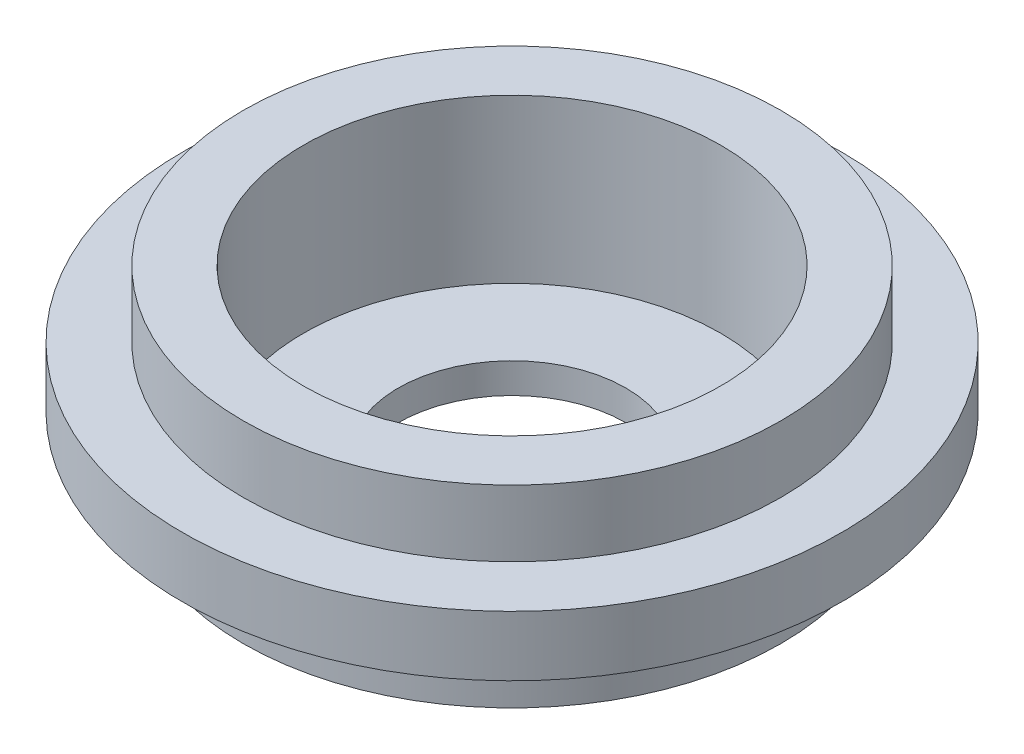
ISO-10303-21;
HEADER;
FILE_DESCRIPTION(('STEP AP214'),'2;1');
FILE_NAME('part.step','',(''),(''),'','','');
FILE_SCHEMA(('AUTOMOTIVE_DESIGN { 1 0 10303 214 1 1 1 1 }'));
ENDSEC;
DATA;
#1=APPLICATION_CONTEXT('core data for automotive mechanical design processes');
#2=APPLICATION_PROTOCOL_DEFINITION('international standard','automotive_design',2000,#1);
#3=PRODUCT_CONTEXT('',#1,'mechanical');
#4=PRODUCT('Part','Part','',(#3));
#5=PRODUCT_RELATED_PRODUCT_CATEGORY('part','',(#4));
#6=PRODUCT_DEFINITION_FORMATION('','',#4);
#7=PRODUCT_DEFINITION_CONTEXT('part definition',#1,'design');
#8=PRODUCT_DEFINITION('design','',#6,#7);
#9=PRODUCT_DEFINITION_SHAPE('','',#8);
#10=(LENGTH_UNIT() NAMED_UNIT(*) SI_UNIT(.MILLI.,.METRE.));
#11=(NAMED_UNIT(*) PLANE_ANGLE_UNIT() SI_UNIT($,.RADIAN.));
#12=(NAMED_UNIT(*) SI_UNIT($,.STERADIAN.) SOLID_ANGLE_UNIT());
#13=UNCERTAINTY_MEASURE_WITH_UNIT(LENGTH_MEASURE(1.E-05),#10,'distance_accuracy_value','');
#14=(GEOMETRIC_REPRESENTATION_CONTEXT(3) GLOBAL_UNCERTAINTY_ASSIGNED_CONTEXT((#13)) GLOBAL_UNIT_ASSIGNED_CONTEXT((#10,
#11,#12)) REPRESENTATION_CONTEXT('',''));
#15=CARTESIAN_POINT('',(0.,0.,0.));
#16=DIRECTION('',(0.,0.,1.));
#17=DIRECTION('',(1.,0.,0.));
#18=AXIS2_PLACEMENT_3D('',#15,#16,#17);
#19=CARTESIAN_POINT('',(0.,5.087499985,11.));
#20=DIRECTION('',(0.,-1.,0.));
#21=DIRECTION('',(0.,0.,-1.));
#22=AXIS2_PLACEMENT_3D('',#19,#20,#21);
#23=PLANE('',#22);
#24=CARTESIAN_POINT('',(0.,5.087499985,0.));
#25=DIRECTION('',(0.,-1.,0.));
#26=DIRECTION('',(0.,0.,-1.));
#27=AXIS2_PLACEMENT_3D('',#24,#25,#26);
#28=CIRCLE('',#27,14.175);
#29=CARTESIAN_POINT('',(0.,5.087499985,-14.175));
#30=VERTEX_POINT('',#29);
#31=EDGE_CURVE('E65',#30,#30,#28,.T.);
#32=ORIENTED_EDGE('',*,*,#31,.F.);
#33=EDGE_LOOP('',(#32));
#34=FACE_BOUND('',#33,.T.);
#35=CARTESIAN_POINT('',(0.,5.087499985,0.));
#36=DIRECTION('',(0.,-1.,0.));
#37=DIRECTION('',(0.,0.,-1.));
#38=AXIS2_PLACEMENT_3D('',#35,#36,#37);
#39=CIRCLE('',#38,11.);
#40=CARTESIAN_POINT('',(0.,5.087499985,-11.));
#41=VERTEX_POINT('',#40);
#42=EDGE_CURVE('E10',#41,#41,#39,.T.);
#43=ORIENTED_EDGE('',*,*,#42,.T.);
#44=EDGE_LOOP('',(#43));
#45=FACE_BOUND('',#44,.T.);
#46=ADVANCED_FACE('F31',(#34,#45),#23,.F.);
#47=CARTESIAN_POINT('',(0.,-5.087499985,0.));
#48=DIRECTION('',(0.,-1.,0.));
#49=DIRECTION('',(0.,0.,-1.));
#50=AXIS2_PLACEMENT_3D('',#47,#48,#49);
#51=CYLINDRICAL_SURFACE('',#50,11.);
#52=ORIENTED_EDGE('',*,*,#42,.F.);
#53=EDGE_LOOP('',(#52));
#54=FACE_BOUND('',#53,.T.);
#55=CARTESIAN_POINT('',(0.,-3.499999985,0.));
#56=DIRECTION('',(0.,-1.,0.));
#57=DIRECTION('',(0.,0.,-1.));
#58=AXIS2_PLACEMENT_3D('',#55,#56,#57);
#59=CIRCLE('',#58,11.);
#60=CARTESIAN_POINT('',(0.,-3.499999985,-11.));
#61=VERTEX_POINT('',#60);
#62=EDGE_CURVE('E37',#61,#61,#59,.T.);
#63=ORIENTED_EDGE('',*,*,#62,.T.);
#64=EDGE_LOOP('',(#63));
#65=FACE_BOUND('',#64,.T.);
#66=ADVANCED_FACE('F72',(#54,#65),#51,.F.);
#67=CARTESIAN_POINT('',(0.,-3.499999985,11.));
#68=DIRECTION('',(0.,-1.,0.));
#69=DIRECTION('',(0.,0.,-1.));
#70=AXIS2_PLACEMENT_3D('',#67,#68,#69);
#71=PLANE('',#70);
#72=ORIENTED_EDGE('',*,*,#62,.F.);
#73=EDGE_LOOP('',(#72));
#74=FACE_BOUND('',#73,.T.);
#75=CARTESIAN_POINT('',(0.,-3.499999985,0.));
#76=DIRECTION('',(0.,-1.,0.));
#77=DIRECTION('',(0.,0.,-1.));
#78=AXIS2_PLACEMENT_3D('',#75,#76,#77);
#79=CIRCLE('',#78,6.);
#80=CARTESIAN_POINT('',(0.,-3.499999985,-6.));
#81=VERTEX_POINT('',#80);
#82=EDGE_CURVE('E41',#81,#81,#79,.T.);
#83=ORIENTED_EDGE('',*,*,#82,.T.);
#84=EDGE_LOOP('',(#83));
#85=FACE_BOUND('',#84,.T.);
#86=ADVANCED_FACE('F76',(#74,#85),#71,.F.);
#87=CARTESIAN_POINT('',(0.,-5.087499985,0.));
#88=DIRECTION('',(0.,-1.,0.));
#89=DIRECTION('',(0.,0.,-1.));
#90=AXIS2_PLACEMENT_3D('',#87,#88,#89);
#91=CYLINDRICAL_SURFACE('',#90,6.);
#92=ORIENTED_EDGE('',*,*,#82,.F.);
#93=EDGE_LOOP('',(#92));
#94=FACE_BOUND('',#93,.T.);
#95=CARTESIAN_POINT('',(0.,-5.087499985,0.));
#96=DIRECTION('',(0.,-1.,0.));
#97=DIRECTION('',(0.,0.,-1.));
#98=AXIS2_PLACEMENT_3D('',#95,#96,#97);
#99=CIRCLE('',#98,6.);
#100=CARTESIAN_POINT('',(0.,-5.087499985,-6.));
#101=VERTEX_POINT('',#100);
#102=EDGE_CURVE('E45',#101,#101,#99,.T.);
#103=ORIENTED_EDGE('',*,*,#102,.T.);
#104=EDGE_LOOP('',(#103));
#105=FACE_BOUND('',#104,.T.);
#106=ADVANCED_FACE('F81',(#94,#105),#91,.F.);
#107=CARTESIAN_POINT('',(0.,-5.087499985,11.));
#108=DIRECTION('',(0.,1.,0.));
#109=DIRECTION('',(0.,0.,1.));
#110=AXIS2_PLACEMENT_3D('',#107,#108,#109);
#111=PLANE('',#110);
#112=ORIENTED_EDGE('',*,*,#102,.F.);
#113=EDGE_LOOP('',(#112));
#114=FACE_BOUND('',#113,.T.);
#115=CARTESIAN_POINT('',(0.,-5.087499985,0.));
#116=DIRECTION('',(0.,-1.,0.));
#117=DIRECTION('',(0.,0.,-1.));
#118=AXIS2_PLACEMENT_3D('',#115,#116,#117);
#119=CIRCLE('',#118,14.175);
#120=CARTESIAN_POINT('',(0.,-5.087499985,-14.175));
#121=VERTEX_POINT('',#120);
#122=EDGE_CURVE('E50',#121,#121,#119,.T.);
#123=ORIENTED_EDGE('',*,*,#122,.T.);
#124=EDGE_LOOP('',(#123));
#125=FACE_BOUND('',#124,.T.);
#126=ADVANCED_FACE('F87',(#114,#125),#111,.F.);
#127=CARTESIAN_POINT('',(0.,-5.087499985,0.));
#128=DIRECTION('',(0.,-1.,0.));
#129=DIRECTION('',(0.,0.,-1.));
#130=AXIS2_PLACEMENT_3D('',#127,#128,#129);
#131=CYLINDRICAL_SURFACE('',#130,14.175);
#132=ORIENTED_EDGE('',*,*,#122,.F.);
#133=EDGE_LOOP('',(#132));
#134=FACE_BOUND('',#133,.T.);
#135=CARTESIAN_POINT('',(0.,-1.585,0.));
#136=DIRECTION('',(0.,-1.,0.));
#137=DIRECTION('',(0.,0.,-1.));
#138=AXIS2_PLACEMENT_3D('',#135,#136,#137);
#139=CIRCLE('',#138,14.175);
#140=CARTESIAN_POINT('',(0.,-1.585,-14.175));
#141=VERTEX_POINT('',#140);
#142=EDGE_CURVE('E53',#141,#141,#139,.T.);
#143=ORIENTED_EDGE('',*,*,#142,.T.);
#144=EDGE_LOOP('',(#143));
#145=FACE_BOUND('',#144,.T.);
#146=ADVANCED_FACE('F91',(#134,#145),#131,.T.);
#147=CARTESIAN_POINT('',(0.,-1.585,17.375));
#148=DIRECTION('',(0.,1.,0.));
#149=DIRECTION('',(0.,0.,1.));
#150=AXIS2_PLACEMENT_3D('',#147,#148,#149);
#151=PLANE('',#150);
#152=ORIENTED_EDGE('',*,*,#142,.F.);
#153=EDGE_LOOP('',(#152));
#154=FACE_BOUND('',#153,.T.);
#155=CARTESIAN_POINT('',(0.,-1.585,0.));
#156=DIRECTION('',(0.,-1.,0.));
#157=DIRECTION('',(0.,0.,-1.));
#158=AXIS2_PLACEMENT_3D('',#155,#156,#157);
#159=CIRCLE('',#158,17.375);
#160=CARTESIAN_POINT('',(0.,-1.585,-17.375));
#161=VERTEX_POINT('',#160);
#162=EDGE_CURVE('E56',#161,#161,#159,.T.);
#163=ORIENTED_EDGE('',*,*,#162,.T.);
#164=EDGE_LOOP('',(#163));
#165=FACE_BOUND('',#164,.T.);
#166=ADVANCED_FACE('F95',(#154,#165),#151,.F.);
#167=CARTESIAN_POINT('',(0.,-5.087499985,0.));
#168=DIRECTION('',(0.,-1.,0.));
#169=DIRECTION('',(0.,0.,-1.));
#170=AXIS2_PLACEMENT_3D('',#167,#168,#169);
#171=CYLINDRICAL_SURFACE('',#170,17.375);
#172=ORIENTED_EDGE('',*,*,#162,.F.);
#173=EDGE_LOOP('',(#172));
#174=FACE_BOUND('',#173,.T.);
#175=CARTESIAN_POINT('',(0.,1.585,0.));
#176=DIRECTION('',(0.,-1.,0.));
#177=DIRECTION('',(0.,0.,-1.));
#178=AXIS2_PLACEMENT_3D('',#175,#176,#177);
#179=CIRCLE('',#178,17.375);
#180=CARTESIAN_POINT('',(0.,1.585,-17.375));
#181=VERTEX_POINT('',#180);
#182=EDGE_CURVE('E59',#181,#181,#179,.T.);
#183=ORIENTED_EDGE('',*,*,#182,.T.);
#184=EDGE_LOOP('',(#183));
#185=FACE_BOUND('',#184,.T.);
#186=ADVANCED_FACE('F99',(#174,#185),#171,.T.);
#187=CARTESIAN_POINT('',(0.,1.585,17.375));
#188=DIRECTION('',(0.,-1.,0.));
#189=DIRECTION('',(0.,0.,-1.));
#190=AXIS2_PLACEMENT_3D('',#187,#188,#189);
#191=PLANE('',#190);
#192=ORIENTED_EDGE('',*,*,#182,.F.);
#193=EDGE_LOOP('',(#192));
#194=FACE_BOUND('',#193,.T.);
#195=CARTESIAN_POINT('',(0.,1.585,0.));
#196=DIRECTION('',(0.,-1.,0.));
#197=DIRECTION('',(0.,0.,-1.));
#198=AXIS2_PLACEMENT_3D('',#195,#196,#197);
#199=CIRCLE('',#198,14.175);
#200=CARTESIAN_POINT('',(0.,1.585,-14.175));
#201=VERTEX_POINT('',#200);
#202=EDGE_CURVE('E62',#201,#201,#199,.T.);
#203=ORIENTED_EDGE('',*,*,#202,.T.);
#204=EDGE_LOOP('',(#203));
#205=FACE_BOUND('',#204,.T.);
#206=ADVANCED_FACE('F103',(#194,#205),#191,.F.);
#207=CARTESIAN_POINT('',(0.,-5.087499985,0.));
#208=DIRECTION('',(0.,-1.,0.));
#209=DIRECTION('',(0.,0.,-1.));
#210=AXIS2_PLACEMENT_3D('',#207,#208,#209);
#211=CYLINDRICAL_SURFACE('',#210,14.175);
#212=ORIENTED_EDGE('',*,*,#202,.F.);
#213=EDGE_LOOP('',(#212));
#214=FACE_BOUND('',#213,.T.);
#215=ORIENTED_EDGE('',*,*,#31,.T.);
#216=EDGE_LOOP('',(#215));
#217=FACE_BOUND('',#216,.T.);
#218=ADVANCED_FACE('F69',(#214,#217),#211,.T.);
#219=CLOSED_SHELL('',(#46,#66,#86,#106,#126,#146,#166,#186,#206,#218));
#220=MANIFOLD_SOLID_BREP('B2',#219);
#221=ADVANCED_BREP_SHAPE_REPRESENTATION('',(#18,#220),#14);
#222=SHAPE_DEFINITION_REPRESENTATION(#9,#221);
ENDSEC;
END-ISO-10303-21;
